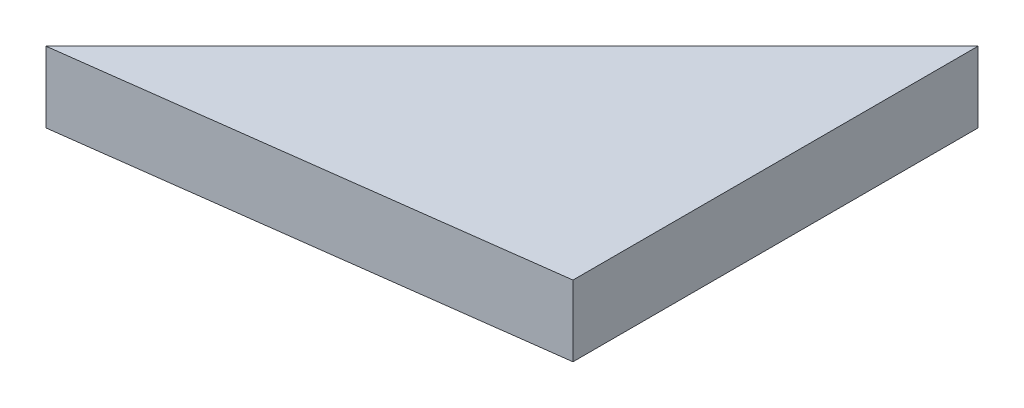
ISO-10303-21;
HEADER;
FILE_DESCRIPTION(('STEP AP214'),'2;1');
FILE_NAME('part.step','',(''),(''),'','','');
FILE_SCHEMA(('AUTOMOTIVE_DESIGN { 1 0 10303 214 1 1 1 1 }'));
ENDSEC;
DATA;
#1=APPLICATION_CONTEXT('core data for automotive mechanical design processes');
#2=APPLICATION_PROTOCOL_DEFINITION('international standard','automotive_design',2000,#1);
#3=PRODUCT_CONTEXT('',#1,'mechanical');
#4=PRODUCT('Part','Part','',(#3));
#5=PRODUCT_RELATED_PRODUCT_CATEGORY('part','',(#4));
#6=PRODUCT_DEFINITION_FORMATION('','',#4);
#7=PRODUCT_DEFINITION_CONTEXT('part definition',#1,'design');
#8=PRODUCT_DEFINITION('design','',#6,#7);
#9=PRODUCT_DEFINITION_SHAPE('','',#8);
#10=(LENGTH_UNIT() NAMED_UNIT(*) SI_UNIT(.MILLI.,.METRE.));
#11=(NAMED_UNIT(*) PLANE_ANGLE_UNIT() SI_UNIT($,.RADIAN.));
#12=(NAMED_UNIT(*) SI_UNIT($,.STERADIAN.) SOLID_ANGLE_UNIT());
#13=UNCERTAINTY_MEASURE_WITH_UNIT(LENGTH_MEASURE(1.E-05),#10,'distance_accuracy_value','');
#14=(GEOMETRIC_REPRESENTATION_CONTEXT(3) GLOBAL_UNCERTAINTY_ASSIGNED_CONTEXT((#13)) GLOBAL_UNIT_ASSIGNED_CONTEXT((#10,
#11,#12)) REPRESENTATION_CONTEXT('',''));
#15=CARTESIAN_POINT('',(0.,0.,0.));
#16=DIRECTION('',(0.,0.,1.));
#17=DIRECTION('',(1.,0.,0.));
#18=AXIS2_PLACEMENT_3D('',#15,#16,#17);
#19=CARTESIAN_POINT('',(0.,3.175,0.));
#20=DIRECTION('',(-0.129747473069321,0.,-0.991547070608413));
#21=DIRECTION('',(-0.991547070608413,0.,0.129747473069321));
#22=AXIS2_PLACEMENT_3D('',#19,#20,#21);
#23=PLANE('',#22);
#24=DIRECTION('',(0.991547070608413,0.,-0.129747473069321));
#25=VECTOR('',#24,1.);
#26=CARTESIAN_POINT('',(0.,0.,0.));
#27=LINE('',#26,#25);
#28=CARTESIAN_POINT('',(-20.8946605995168,0.,2.73414091351701));
#29=VERTEX_POINT('',#28);
#30=CARTESIAN_POINT('',(0.,0.,0.));
#31=VERTEX_POINT('',#30);
#32=EDGE_CURVE('E95',#29,#31,#27,.T.);
#33=ORIENTED_EDGE('',*,*,#32,.T.);
#34=DIRECTION('',(0.,-1.,0.));
#35=VECTOR('',#34,1.);
#36=CARTESIAN_POINT('',(0.,3.175,0.));
#37=LINE('',#36,#35);
#38=CARTESIAN_POINT('',(0.,3.175,0.));
#39=VERTEX_POINT('',#38);
#40=EDGE_CURVE('E11',#39,#31,#37,.T.);
#41=ORIENTED_EDGE('',*,*,#40,.F.);
#42=DIRECTION('',(0.991547070608413,0.,-0.129747473069321));
#43=VECTOR('',#42,1.);
#44=CARTESIAN_POINT('',(0.,3.175,0.));
#45=LINE('',#44,#43);
#46=CARTESIAN_POINT('',(-20.8946605995168,3.175,2.73414091351701));
#47=VERTEX_POINT('',#46);
#48=EDGE_CURVE('E87',#47,#39,#45,.T.);
#49=ORIENTED_EDGE('',*,*,#48,.F.);
#50=DIRECTION('',(0.,-1.,0.));
#51=VECTOR('',#50,1.);
#52=CARTESIAN_POINT('',(-20.8946605995168,3.175,2.73414091351701));
#53=LINE('',#52,#51);
#54=EDGE_CURVE('E96',#47,#29,#53,.T.);
#55=ORIENTED_EDGE('',*,*,#54,.T.);
#56=EDGE_LOOP('',(#33,#41,#49,#55));
#57=FACE_BOUND('',#56,.T.);
#58=ADVANCED_FACE('F45',(#57),#23,.F.);
#59=CARTESIAN_POINT('',(0.,3.175,0.));
#60=DIRECTION('',(-1.,0.,0.));
#61=DIRECTION('',(0.,0.,1.));
#62=AXIS2_PLACEMENT_3D('',#59,#60,#61);
#63=PLANE('',#62);
#64=DIRECTION('',(0.,0.,-1.));
#65=VECTOR('',#64,1.);
#66=CARTESIAN_POINT('',(0.,0.,0.));
#67=LINE('',#66,#65);
#68=CARTESIAN_POINT('',(0.,0.,-18.160519686));
#69=VERTEX_POINT('',#68);
#70=EDGE_CURVE('E74',#31,#69,#67,.T.);
#71=ORIENTED_EDGE('',*,*,#70,.T.);
#72=DIRECTION('',(0.,-1.,0.));
#73=VECTOR('',#72,1.);
#74=CARTESIAN_POINT('',(0.,3.175,-18.160519686));
#75=LINE('',#74,#73);
#76=CARTESIAN_POINT('',(0.,3.175,-18.160519686));
#77=VERTEX_POINT('',#76);
#78=EDGE_CURVE('E54',#77,#69,#75,.T.);
#79=ORIENTED_EDGE('',*,*,#78,.F.);
#80=DIRECTION('',(0.,0.,-1.));
#81=VECTOR('',#80,1.);
#82=CARTESIAN_POINT('',(0.,3.175,0.));
#83=LINE('',#82,#81);
#84=EDGE_CURVE('E82',#39,#77,#83,.T.);
#85=ORIENTED_EDGE('',*,*,#84,.F.);
#86=ORIENTED_EDGE('',*,*,#40,.T.);
#87=EDGE_LOOP('',(#71,#79,#85,#86));
#88=FACE_BOUND('',#87,.T.);
#89=ADVANCED_FACE('F83',(#88),#63,.F.);
#90=CARTESIAN_POINT('',(0.,3.175,-18.160519686));
#91=DIRECTION('',(0.707106781186551,0.,0.707106781186544));
#92=DIRECTION('',(0.707106781186544,0.,-0.707106781186551));
#93=AXIS2_PLACEMENT_3D('',#90,#91,#92);
#94=PLANE('',#93);
#95=DIRECTION('',(-0.707106781186544,0.,0.707106781186551));
#96=VECTOR('',#95,1.);
#97=CARTESIAN_POINT('',(0.,0.,-18.160519686));
#98=LINE('',#97,#96);
#99=EDGE_CURVE('E79',#69,#29,#98,.T.);
#100=ORIENTED_EDGE('',*,*,#99,.T.);
#101=ORIENTED_EDGE('',*,*,#54,.F.);
#102=DIRECTION('',(-0.707106781186544,0.,0.707106781186551));
#103=VECTOR('',#102,1.);
#104=CARTESIAN_POINT('',(0.,3.175,-18.160519686));
#105=LINE('',#104,#103);
#106=EDGE_CURVE('E62',#77,#47,#105,.T.);
#107=ORIENTED_EDGE('',*,*,#106,.F.);
#108=ORIENTED_EDGE('',*,*,#78,.T.);
#109=EDGE_LOOP('',(#100,#101,#107,#108));
#110=FACE_BOUND('',#109,.T.);
#111=ADVANCED_FACE('F108',(#110),#94,.F.);
#112=CARTESIAN_POINT('',(0.,3.175,0.));
#113=DIRECTION('',(0.,-1.,0.));
#114=DIRECTION('',(0.,0.,-1.));
#115=AXIS2_PLACEMENT_3D('',#112,#113,#114);
#116=PLANE('',#115);
#117=ORIENTED_EDGE('',*,*,#48,.T.);
#118=ORIENTED_EDGE('',*,*,#84,.T.);
#119=ORIENTED_EDGE('',*,*,#106,.T.);
#120=EDGE_LOOP('',(#117,#118,#119));
#121=FACE_BOUND('',#120,.T.);
#122=ADVANCED_FACE('F90',(#121),#116,.F.);
#123=CARTESIAN_POINT('',(0.,0.,0.));
#124=DIRECTION('',(0.,-1.,0.));
#125=DIRECTION('',(0.,0.,-1.));
#126=AXIS2_PLACEMENT_3D('',#123,#124,#125);
#127=PLANE('',#126);
#128=ORIENTED_EDGE('',*,*,#32,.F.);
#129=ORIENTED_EDGE('',*,*,#99,.F.);
#130=ORIENTED_EDGE('',*,*,#70,.F.);
#131=EDGE_LOOP('',(#128,#129,#130));
#132=FACE_BOUND('',#131,.T.);
#133=ADVANCED_FACE('F109',(#132),#127,.T.);
#134=CLOSED_SHELL('',(#58,#89,#111,#122,#133));
#135=MANIFOLD_SOLID_BREP('B2',#134);
#136=ADVANCED_BREP_SHAPE_REPRESENTATION('',(#18,#135),#14);
#137=SHAPE_DEFINITION_REPRESENTATION(#9,#136);
ENDSEC;
END-ISO-10303-21;
